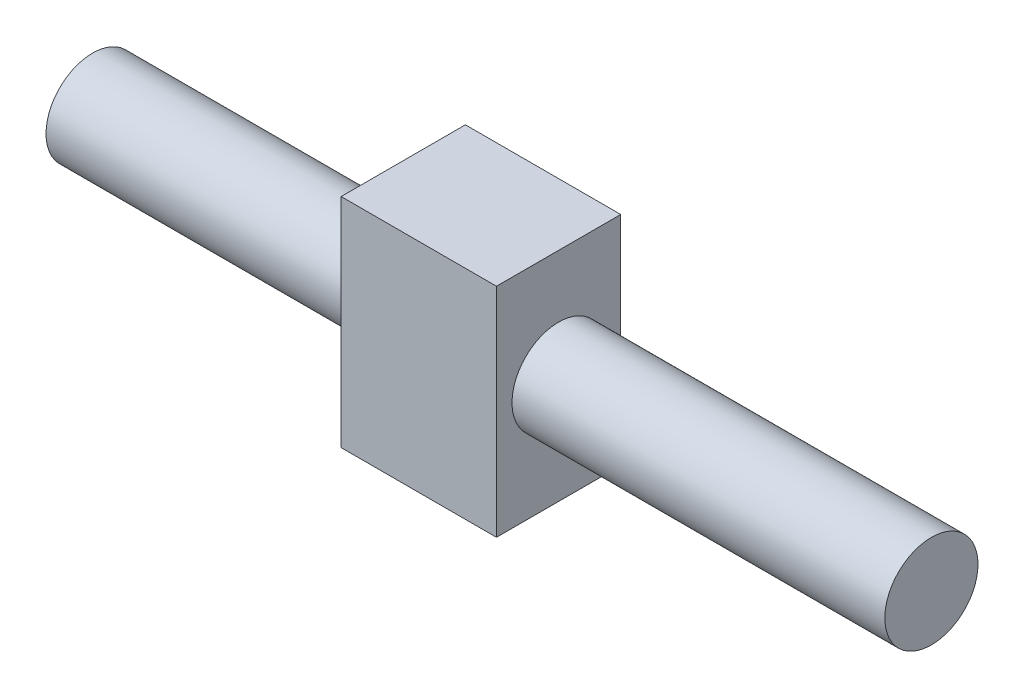
ISO-10303-21;
HEADER;
FILE_DESCRIPTION(('STEP AP214'),'2;1');
FILE_NAME('part.step','',(''),(''),'','','');
FILE_SCHEMA(('AUTOMOTIVE_DESIGN { 1 0 10303 214 1 1 1 1 }'));
ENDSEC;
DATA;
#1=APPLICATION_CONTEXT('core data for automotive mechanical design processes');
#2=APPLICATION_PROTOCOL_DEFINITION('international standard','automotive_design',2000,#1);
#3=PRODUCT_CONTEXT('',#1,'mechanical');
#4=PRODUCT('Part','Part','',(#3));
#5=PRODUCT_RELATED_PRODUCT_CATEGORY('part','',(#4));
#6=PRODUCT_DEFINITION_FORMATION('','',#4);
#7=PRODUCT_DEFINITION_CONTEXT('part definition',#1,'design');
#8=PRODUCT_DEFINITION('design','',#6,#7);
#9=PRODUCT_DEFINITION_SHAPE('','',#8);
#10=(LENGTH_UNIT() NAMED_UNIT(*) SI_UNIT(.MILLI.,.METRE.));
#11=(NAMED_UNIT(*) PLANE_ANGLE_UNIT() SI_UNIT($,.RADIAN.));
#12=(NAMED_UNIT(*) SI_UNIT($,.STERADIAN.) SOLID_ANGLE_UNIT());
#13=UNCERTAINTY_MEASURE_WITH_UNIT(LENGTH_MEASURE(1.E-05),#10,'distance_accuracy_value','');
#14=(GEOMETRIC_REPRESENTATION_CONTEXT(3) GLOBAL_UNCERTAINTY_ASSIGNED_CONTEXT((#13)) GLOBAL_UNIT_ASSIGNED_CONTEXT((#10,
#11,#12)) REPRESENTATION_CONTEXT('',''));
#15=CARTESIAN_POINT('',(0.,0.,0.));
#16=DIRECTION('',(0.,0.,1.));
#17=DIRECTION('',(1.,0.,0.));
#18=AXIS2_PLACEMENT_3D('',#15,#16,#17);
#19=CARTESIAN_POINT('',(0.,0.,40.));
#20=DIRECTION('',(-1.,0.,0.));
#21=DIRECTION('',(0.,0.,1.));
#22=AXIS2_PLACEMENT_3D('',#19,#20,#21);
#23=PLANE('',#22);
#24=CARTESIAN_POINT('',(0.,35.,20.));
#25=DIRECTION('',(1.,0.,0.));
#26=DIRECTION('',(0.,0.,-1.));
#27=AXIS2_PLACEMENT_3D('',#24,#25,#26);
#28=CIRCLE('',#27,15.);
#29=CARTESIAN_POINT('',(0.,35.,5.));
#30=VERTEX_POINT('',#29);
#31=EDGE_CURVE('E11',#30,#30,#28,.T.);
#32=ORIENTED_EDGE('',*,*,#31,.F.);
#33=EDGE_LOOP('',(#32));
#34=FACE_BOUND('',#33,.T.);
#35=DIRECTION('',(0.,1.,0.));
#36=VECTOR('',#35,1.);
#37=CARTESIAN_POINT('',(0.,0.,0.));
#38=LINE('',#37,#36);
#39=CARTESIAN_POINT('',(0.,0.,0.));
#40=VERTEX_POINT('',#39);
#41=CARTESIAN_POINT('',(0.,70.,0.));
#42=VERTEX_POINT('',#41);
#43=EDGE_CURVE('E100',#40,#42,#38,.T.);
#44=ORIENTED_EDGE('',*,*,#43,.T.);
#45=DIRECTION('',(0.,0.,-1.));
#46=VECTOR('',#45,1.);
#47=CARTESIAN_POINT('',(0.,70.,40.));
#48=LINE('',#47,#46);
#49=CARTESIAN_POINT('',(0.,70.,40.));
#50=VERTEX_POINT('',#49);
#51=EDGE_CURVE('E36',#50,#42,#48,.T.);
#52=ORIENTED_EDGE('',*,*,#51,.F.);
#53=DIRECTION('',(0.,1.,0.));
#54=VECTOR('',#53,1.);
#55=CARTESIAN_POINT('',(0.,0.,40.));
#56=LINE('',#55,#54);
#57=CARTESIAN_POINT('',(0.,0.,40.));
#58=VERTEX_POINT('',#57);
#59=EDGE_CURVE('E87',#58,#50,#56,.T.);
#60=ORIENTED_EDGE('',*,*,#59,.F.);
#61=DIRECTION('',(0.,0.,-1.));
#62=VECTOR('',#61,1.);
#63=CARTESIAN_POINT('',(0.,0.,40.));
#64=LINE('',#63,#62);
#65=EDGE_CURVE('E96',#58,#40,#64,.T.);
#66=ORIENTED_EDGE('',*,*,#65,.T.);
#67=EDGE_LOOP('',(#44,#52,#60,#66));
#68=FACE_BOUND('',#67,.T.);
#69=ADVANCED_FACE('F33',(#34,#68),#23,.F.);
#70=CARTESIAN_POINT('',(0.,70.,40.));
#71=DIRECTION('',(0.,-1.,0.));
#72=DIRECTION('',(1.,0.,0.));
#73=AXIS2_PLACEMENT_3D('',#70,#71,#72);
#74=PLANE('',#73);
#75=DIRECTION('',(-1.,0.,0.));
#76=VECTOR('',#75,1.);
#77=CARTESIAN_POINT('',(0.,70.,0.));
#78=LINE('',#77,#76);
#79=CARTESIAN_POINT('',(-50.,70.,0.));
#80=VERTEX_POINT('',#79);
#81=EDGE_CURVE('E92',#42,#80,#78,.T.);
#82=ORIENTED_EDGE('',*,*,#81,.T.);
#83=DIRECTION('',(0.,0.,-1.));
#84=VECTOR('',#83,1.);
#85=CARTESIAN_POINT('',(-50.,70.,40.));
#86=LINE('',#85,#84);
#87=CARTESIAN_POINT('',(-50.,70.,40.));
#88=VERTEX_POINT('',#87);
#89=EDGE_CURVE('E90',#88,#80,#86,.T.);
#90=ORIENTED_EDGE('',*,*,#89,.F.);
#91=DIRECTION('',(-1.,0.,0.));
#92=VECTOR('',#91,1.);
#93=CARTESIAN_POINT('',(0.,70.,40.));
#94=LINE('',#93,#92);
#95=EDGE_CURVE('E82',#50,#88,#94,.T.);
#96=ORIENTED_EDGE('',*,*,#95,.F.);
#97=ORIENTED_EDGE('',*,*,#51,.T.);
#98=EDGE_LOOP('',(#82,#90,#96,#97));
#99=FACE_BOUND('',#98,.T.);
#100=ADVANCED_FACE('F91',(#99),#74,.F.);
#101=CARTESIAN_POINT('',(-50.,0.,40.));
#102=DIRECTION('',(1.,0.,0.));
#103=DIRECTION('',(0.,0.,-1.));
#104=AXIS2_PLACEMENT_3D('',#101,#102,#103);
#105=PLANE('',#104);
#106=CARTESIAN_POINT('',(-50.,35.,20.));
#107=DIRECTION('',(-1.,0.,0.));
#108=DIRECTION('',(0.,0.,1.));
#109=AXIS2_PLACEMENT_3D('',#106,#107,#108);
#110=CIRCLE('',#109,15.);
#111=CARTESIAN_POINT('',(-50.,35.,35.));
#112=VERTEX_POINT('',#111);
#113=EDGE_CURVE('E42',#112,#112,#110,.T.);
#114=ORIENTED_EDGE('',*,*,#113,.F.);
#115=EDGE_LOOP('',(#114));
#116=FACE_BOUND('',#115,.T.);
#117=DIRECTION('',(0.,-1.,0.));
#118=VECTOR('',#117,1.);
#119=CARTESIAN_POINT('',(-50.,0.,0.));
#120=LINE('',#119,#118);
#121=CARTESIAN_POINT('',(-50.,0.,0.));
#122=VERTEX_POINT('',#121);
#123=EDGE_CURVE('E68',#80,#122,#120,.T.);
#124=ORIENTED_EDGE('',*,*,#123,.T.);
#125=DIRECTION('',(0.,0.,-1.));
#126=VECTOR('',#125,1.);
#127=CARTESIAN_POINT('',(-50.,0.,40.));
#128=LINE('',#127,#126);
#129=CARTESIAN_POINT('',(-50.,0.,40.));
#130=VERTEX_POINT('',#129);
#131=EDGE_CURVE('E93',#130,#122,#128,.T.);
#132=ORIENTED_EDGE('',*,*,#131,.F.);
#133=DIRECTION('',(0.,-1.,0.));
#134=VECTOR('',#133,1.);
#135=CARTESIAN_POINT('',(-50.,0.,40.));
#136=LINE('',#135,#134);
#137=EDGE_CURVE('E85',#88,#130,#136,.T.);
#138=ORIENTED_EDGE('',*,*,#137,.F.);
#139=ORIENTED_EDGE('',*,*,#89,.T.);
#140=EDGE_LOOP('',(#124,#132,#138,#139));
#141=FACE_BOUND('',#140,.T.);
#142=ADVANCED_FACE('F94',(#116,#141),#105,.F.);
#143=CARTESIAN_POINT('',(0.,0.,40.));
#144=DIRECTION('',(0.,1.,0.));
#145=DIRECTION('',(-1.,0.,0.));
#146=AXIS2_PLACEMENT_3D('',#143,#144,#145);
#147=PLANE('',#146);
#148=DIRECTION('',(1.,0.,0.));
#149=VECTOR('',#148,1.);
#150=CARTESIAN_POINT('',(0.,0.,0.));
#151=LINE('',#150,#149);
#152=EDGE_CURVE('E74',#122,#40,#151,.T.);
#153=ORIENTED_EDGE('',*,*,#152,.T.);
#154=ORIENTED_EDGE('',*,*,#65,.F.);
#155=DIRECTION('',(1.,0.,0.));
#156=VECTOR('',#155,1.);
#157=CARTESIAN_POINT('',(0.,0.,40.));
#158=LINE('',#157,#156);
#159=EDGE_CURVE('E51',#130,#58,#158,.T.);
#160=ORIENTED_EDGE('',*,*,#159,.F.);
#161=ORIENTED_EDGE('',*,*,#131,.T.);
#162=EDGE_LOOP('',(#153,#154,#160,#161));
#163=FACE_BOUND('',#162,.T.);
#164=ADVANCED_FACE('F108',(#163),#147,.F.);
#165=CARTESIAN_POINT('',(0.,0.,40.));
#166=DIRECTION('',(0.,0.,1.));
#167=DIRECTION('',(1.,0.,0.));
#168=AXIS2_PLACEMENT_3D('',#165,#166,#167);
#169=PLANE('',#168);
#170=ORIENTED_EDGE('',*,*,#59,.T.);
#171=ORIENTED_EDGE('',*,*,#95,.T.);
#172=ORIENTED_EDGE('',*,*,#137,.T.);
#173=ORIENTED_EDGE('',*,*,#159,.T.);
#174=EDGE_LOOP('',(#170,#171,#172,#173));
#175=FACE_BOUND('',#174,.T.);
#176=ADVANCED_FACE('F83',(#175),#169,.T.);
#177=CARTESIAN_POINT('',(0.,0.,0.));
#178=DIRECTION('',(0.,0.,1.));
#179=DIRECTION('',(1.,0.,0.));
#180=AXIS2_PLACEMENT_3D('',#177,#178,#179);
#181=PLANE('',#180);
#182=ORIENTED_EDGE('',*,*,#43,.F.);
#183=ORIENTED_EDGE('',*,*,#152,.F.);
#184=ORIENTED_EDGE('',*,*,#123,.F.);
#185=ORIENTED_EDGE('',*,*,#81,.F.);
#186=EDGE_LOOP('',(#182,#183,#184,#185));
#187=FACE_BOUND('',#186,.T.);
#188=ADVANCED_FACE('F111',(#187),#181,.F.);
#189=CARTESIAN_POINT('',(-150.,35.,20.));
#190=DIRECTION('',(1.,0.,0.));
#191=DIRECTION('',(0.,0.,-1.));
#192=AXIS2_PLACEMENT_3D('',#189,#190,#191);
#193=CYLINDRICAL_SURFACE('',#192,15.);
#194=CARTESIAN_POINT('',(-150.,35.,20.));
#195=DIRECTION('',(-1.,0.,0.));
#196=DIRECTION('',(0.,0.,1.));
#197=AXIS2_PLACEMENT_3D('',#194,#195,#196);
#198=CIRCLE('',#197,15.);
#199=CARTESIAN_POINT('',(-150.,35.,35.));
#200=VERTEX_POINT('',#199);
#201=EDGE_CURVE('E103',#200,#200,#198,.T.);
#202=ORIENTED_EDGE('',*,*,#201,.F.);
#203=EDGE_LOOP('',(#202));
#204=FACE_BOUND('',#203,.T.);
#205=ORIENTED_EDGE('',*,*,#113,.T.);
#206=EDGE_LOOP('',(#205));
#207=FACE_BOUND('',#206,.T.);
#208=ADVANCED_FACE('F145',(#204,#207),#193,.T.);
#209=CARTESIAN_POINT('',(-150.,35.,20.));
#210=DIRECTION('',(-1.,0.,0.));
#211=DIRECTION('',(0.,0.,1.));
#212=AXIS2_PLACEMENT_3D('',#209,#210,#211);
#213=PLANE('',#212);
#214=ORIENTED_EDGE('',*,*,#201,.T.);
#215=EDGE_LOOP('',(#214));
#216=FACE_BOUND('',#215,.T.);
#217=ADVANCED_FACE('F127',(#216),#213,.T.);
#218=CARTESIAN_POINT('',(120.,35.,20.));
#219=DIRECTION('',(-1.,0.,0.));
#220=DIRECTION('',(0.,0.,1.));
#221=AXIS2_PLACEMENT_3D('',#218,#219,#220);
#222=CYLINDRICAL_SURFACE('',#221,15.);
#223=CARTESIAN_POINT('',(120.,35.,20.));
#224=DIRECTION('',(1.,0.,0.));
#225=DIRECTION('',(0.,0.,-1.));
#226=AXIS2_PLACEMENT_3D('',#223,#224,#225);
#227=CIRCLE('',#226,15.);
#228=CARTESIAN_POINT('',(120.,35.,5.));
#229=VERTEX_POINT('',#228);
#230=EDGE_CURVE('E117',#229,#229,#227,.T.);
#231=ORIENTED_EDGE('',*,*,#230,.F.);
#232=EDGE_LOOP('',(#231));
#233=FACE_BOUND('',#232,.T.);
#234=ORIENTED_EDGE('',*,*,#31,.T.);
#235=EDGE_LOOP('',(#234));
#236=FACE_BOUND('',#235,.T.);
#237=ADVANCED_FACE('F124',(#233,#236),#222,.T.);
#238=CARTESIAN_POINT('',(120.,35.,20.));
#239=DIRECTION('',(1.,0.,0.));
#240=DIRECTION('',(0.,0.,-1.));
#241=AXIS2_PLACEMENT_3D('',#238,#239,#240);
#242=PLANE('',#241);
#243=ORIENTED_EDGE('',*,*,#230,.T.);
#244=EDGE_LOOP('',(#243));
#245=FACE_BOUND('',#244,.T.);
#246=ADVANCED_FACE('F122',(#245),#242,.T.);
#247=CLOSED_SHELL('',(#69,#100,#142,#164,#176,#188,#208,#217,#237,#246));
#248=MANIFOLD_SOLID_BREP('B2',#247);
#249=ADVANCED_BREP_SHAPE_REPRESENTATION('',(#18,#248),#14);
#250=SHAPE_DEFINITION_REPRESENTATION(#9,#249);
ENDSEC;
END-ISO-10303-21;
